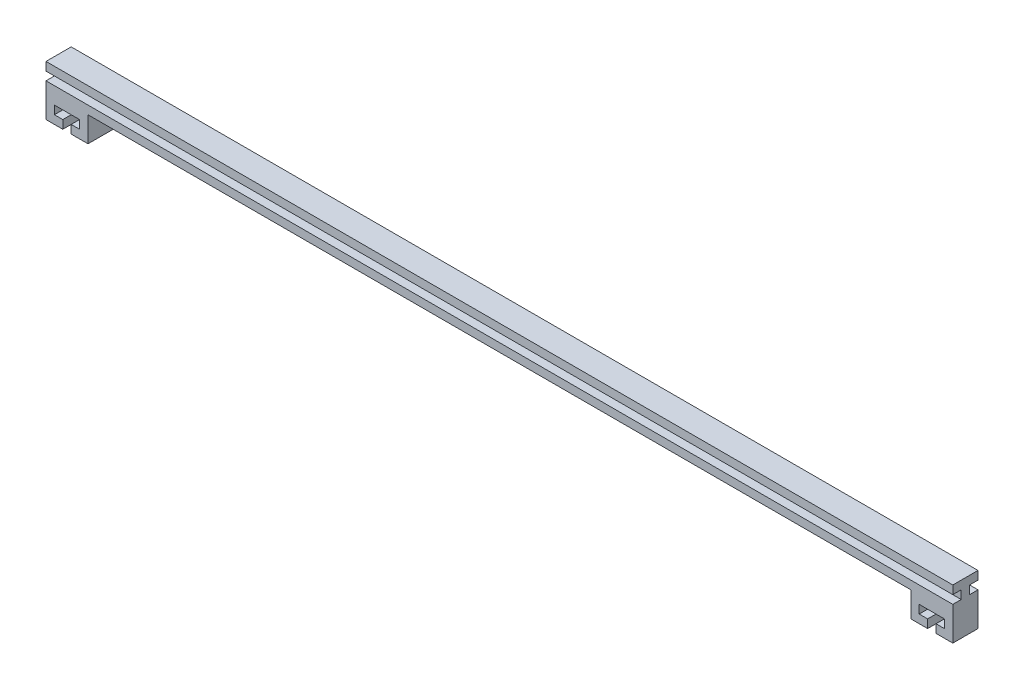
ISO-10303-21;
HEADER;
FILE_DESCRIPTION(('STEP AP214'),'2;1');
FILE_NAME('part.step','',(''),(''),'','','');
FILE_SCHEMA(('AUTOMOTIVE_DESIGN { 1 0 10303 214 1 1 1 1 }'));
ENDSEC;
DATA;
#1=APPLICATION_CONTEXT('core data for automotive mechanical design processes');
#2=APPLICATION_PROTOCOL_DEFINITION('international standard','automotive_design',2000,#1);
#3=PRODUCT_CONTEXT('',#1,'mechanical');
#4=PRODUCT('Part','Part','',(#3));
#5=PRODUCT_RELATED_PRODUCT_CATEGORY('part','',(#4));
#6=PRODUCT_DEFINITION_FORMATION('','',#4);
#7=PRODUCT_DEFINITION_CONTEXT('part definition',#1,'design');
#8=PRODUCT_DEFINITION('design','',#6,#7);
#9=PRODUCT_DEFINITION_SHAPE('','',#8);
#10=(LENGTH_UNIT() NAMED_UNIT(*) SI_UNIT(.MILLI.,.METRE.));
#11=(NAMED_UNIT(*) PLANE_ANGLE_UNIT() SI_UNIT($,.RADIAN.));
#12=(NAMED_UNIT(*) SI_UNIT($,.STERADIAN.) SOLID_ANGLE_UNIT());
#13=UNCERTAINTY_MEASURE_WITH_UNIT(LENGTH_MEASURE(1.E-05),#10,'distance_accuracy_value','');
#14=(GEOMETRIC_REPRESENTATION_CONTEXT(3) GLOBAL_UNCERTAINTY_ASSIGNED_CONTEXT((#13)) GLOBAL_UNIT_ASSIGNED_CONTEXT((#10,
#11,#12)) REPRESENTATION_CONTEXT('',''));
#15=CARTESIAN_POINT('',(0.,0.,0.));
#16=DIRECTION('',(0.,0.,1.));
#17=DIRECTION('',(1.,0.,0.));
#18=AXIS2_PLACEMENT_3D('',#15,#16,#17);
#19=CARTESIAN_POINT('',(2700.,200.,0.));
#20=DIRECTION('',(0.,-1.,0.));
#21=DIRECTION('',(0.,0.,-1.));
#22=AXIS2_PLACEMENT_3D('',#19,#20,#21);
#23=PLANE('',#22);
#24=DIRECTION('',(-1.,0.,0.));
#25=VECTOR('',#24,1.);
#26=CARTESIAN_POINT('',(2700.,200.,0.));
#27=LINE('',#26,#25);
#28=CARTESIAN_POINT('',(2450.,200.,0.));
#29=VERTEX_POINT('',#28);
#30=CARTESIAN_POINT('',(-2450.,200.,0.));
#31=VERTEX_POINT('',#30);
#32=EDGE_CURVE('E50',#29,#31,#27,.T.);
#33=ORIENTED_EDGE('',*,*,#32,.F.);
#34=DIRECTION('',(0.,0.,-1.));
#35=VECTOR('',#34,1.);
#36=CARTESIAN_POINT('',(2450.,200.,150.));
#37=LINE('',#36,#35);
#38=CARTESIAN_POINT('',(2450.,200.,150.));
#39=VERTEX_POINT('',#38);
#40=EDGE_CURVE('E54',#39,#29,#37,.T.);
#41=ORIENTED_EDGE('',*,*,#40,.F.);
#42=DIRECTION('',(-1.,0.,0.));
#43=VECTOR('',#42,1.);
#44=CARTESIAN_POINT('',(2700.,200.,150.));
#45=LINE('',#44,#43);
#46=CARTESIAN_POINT('',(-2450.,200.,150.));
#47=VERTEX_POINT('',#46);
#48=EDGE_CURVE('E259',#39,#47,#45,.T.);
#49=ORIENTED_EDGE('',*,*,#48,.T.);
#50=DIRECTION('',(0.,0.,-1.));
#51=VECTOR('',#50,1.);
#52=CARTESIAN_POINT('',(-2450.,200.,150.));
#53=LINE('',#52,#51);
#54=EDGE_CURVE('E378',#47,#31,#53,.T.);
#55=ORIENTED_EDGE('',*,*,#54,.T.);
#56=EDGE_LOOP('',(#33,#41,#49,#55));
#57=FACE_BOUND('',#56,.T.);
#58=ADVANCED_FACE('F35',(#57),#23,.T.);
#59=CARTESIAN_POINT('',(-2700.,49.9999999999997,150.));
#60=DIRECTION('',(1.,0.,0.));
#61=DIRECTION('',(0.,0.,-1.));
#62=AXIS2_PLACEMENT_3D('',#59,#60,#61);
#63=PLANE('',#62);
#64=DIRECTION('',(0.,-1.,0.));
#65=VECTOR('',#64,1.);
#66=CARTESIAN_POINT('',(-2700.,49.9999999999997,0.));
#67=LINE('',#66,#65);
#68=CARTESIAN_POINT('',(-2700.,250.,0.));
#69=VERTEX_POINT('',#68);
#70=CARTESIAN_POINT('',(-2700.,49.9999999999997,0.));
#71=VERTEX_POINT('',#70);
#72=EDGE_CURVE('E333',#69,#71,#67,.T.);
#73=ORIENTED_EDGE('',*,*,#72,.T.);
#74=DIRECTION('',(0.,0.,-1.));
#75=VECTOR('',#74,1.);
#76=CARTESIAN_POINT('',(-2700.,49.9999999999997,150.));
#77=LINE('',#76,#75);
#78=CARTESIAN_POINT('',(-2700.,49.9999999999997,150.));
#79=VERTEX_POINT('',#78);
#80=EDGE_CURVE('E11',#79,#71,#77,.T.);
#81=ORIENTED_EDGE('',*,*,#80,.F.);
#82=DIRECTION('',(0.,-1.,0.));
#83=VECTOR('',#82,1.);
#84=CARTESIAN_POINT('',(-2700.,49.9999999999997,150.));
#85=LINE('',#84,#83);
#86=CARTESIAN_POINT('',(-2700.,250.,150.));
#87=VERTEX_POINT('',#86);
#88=EDGE_CURVE('E355',#87,#79,#85,.T.);
#89=ORIENTED_EDGE('',*,*,#88,.F.);
#90=DIRECTION('',(0.,0.,-1.));
#91=VECTOR('',#90,1.);
#92=CARTESIAN_POINT('',(-2700.,250.,150.));
#93=LINE('',#92,#91);
#94=CARTESIAN_POINT('',(-2700.,250.,100.));
#95=VERTEX_POINT('',#94);
#96=EDGE_CURVE('E266',#87,#95,#93,.T.);
#97=ORIENTED_EDGE('',*,*,#96,.T.);
#98=DIRECTION('',(0.,1.,0.));
#99=VECTOR('',#98,1.);
#100=CARTESIAN_POINT('',(-2700.,250.,100.));
#101=LINE('',#100,#99);
#102=CARTESIAN_POINT('',(-2700.,300.,100.));
#103=VERTEX_POINT('',#102);
#104=EDGE_CURVE('E269',#95,#103,#101,.T.);
#105=ORIENTED_EDGE('',*,*,#104,.T.);
#106=DIRECTION('',(0.,0.,1.));
#107=VECTOR('',#106,1.);
#108=CARTESIAN_POINT('',(-2700.,300.,100.));
#109=LINE('',#108,#107);
#110=CARTESIAN_POINT('',(-2700.,300.,150.));
#111=VERTEX_POINT('',#110);
#112=EDGE_CURVE('E310',#103,#111,#109,.T.);
#113=ORIENTED_EDGE('',*,*,#112,.T.);
#114=DIRECTION('',(0.,1.,0.));
#115=VECTOR('',#114,1.);
#116=CARTESIAN_POINT('',(-2700.,300.,150.));
#117=LINE('',#116,#115);
#118=CARTESIAN_POINT('',(-2700.,350.,150.));
#119=VERTEX_POINT('',#118);
#120=EDGE_CURVE('E313',#111,#119,#117,.T.);
#121=ORIENTED_EDGE('',*,*,#120,.T.);
#122=DIRECTION('',(0.,0.,-1.));
#123=VECTOR('',#122,1.);
#124=CARTESIAN_POINT('',(-2700.,350.,150.));
#125=LINE('',#124,#123);
#126=CARTESIAN_POINT('',(-2700.,350.,0.));
#127=VERTEX_POINT('',#126);
#128=EDGE_CURVE('E316',#119,#127,#125,.T.);
#129=ORIENTED_EDGE('',*,*,#128,.T.);
#130=DIRECTION('',(0.,-1.,0.));
#131=VECTOR('',#130,1.);
#132=CARTESIAN_POINT('',(-2700.,350.,0.));
#133=LINE('',#132,#131);
#134=CARTESIAN_POINT('',(-2700.,300.,0.));
#135=VERTEX_POINT('',#134);
#136=EDGE_CURVE('E319',#127,#135,#133,.T.);
#137=ORIENTED_EDGE('',*,*,#136,.T.);
#138=DIRECTION('',(0.,0.,1.));
#139=VECTOR('',#138,1.);
#140=CARTESIAN_POINT('',(-2700.,300.,0.));
#141=LINE('',#140,#139);
#142=CARTESIAN_POINT('',(-2700.,300.,50.));
#143=VERTEX_POINT('',#142);
#144=EDGE_CURVE('E322',#135,#143,#141,.T.);
#145=ORIENTED_EDGE('',*,*,#144,.T.);
#146=DIRECTION('',(0.,-1.,0.));
#147=VECTOR('',#146,1.);
#148=CARTESIAN_POINT('',(-2700.,300.,50.));
#149=LINE('',#148,#147);
#150=CARTESIAN_POINT('',(-2700.,250.,50.));
#151=VERTEX_POINT('',#150);
#152=EDGE_CURVE('E325',#143,#151,#149,.T.);
#153=ORIENTED_EDGE('',*,*,#152,.T.);
#154=DIRECTION('',(0.,0.,-1.));
#155=VECTOR('',#154,1.);
#156=CARTESIAN_POINT('',(-2700.,250.,50.));
#157=LINE('',#156,#155);
#158=EDGE_CURVE('E278',#151,#69,#157,.T.);
#159=ORIENTED_EDGE('',*,*,#158,.T.);
#160=EDGE_LOOP('',(#73,#81,#89,#97,#105,#113,#121,#129,#137,#145,#153,#159));
#161=FACE_BOUND('',#160,.T.);
#162=ADVANCED_FACE('F37',(#161),#63,.F.);
#163=CARTESIAN_POINT('',(-2600.,49.9999999999997,150.));
#164=DIRECTION('',(0.,1.,0.));
#165=DIRECTION('',(0.,0.,1.));
#166=AXIS2_PLACEMENT_3D('',#163,#164,#165);
#167=PLANE('',#166);
#168=DIRECTION('',(1.,0.,0.));
#169=VECTOR('',#168,1.);
#170=CARTESIAN_POINT('',(-2600.,49.9999999999997,0.));
#171=LINE('',#170,#169);
#172=CARTESIAN_POINT('',(-2600.,49.9999999999997,0.));
#173=VERTEX_POINT('',#172);
#174=EDGE_CURVE('E381',#71,#173,#171,.T.);
#175=ORIENTED_EDGE('',*,*,#174,.T.);
#176=DIRECTION('',(0.,0.,-1.));
#177=VECTOR('',#176,1.);
#178=CARTESIAN_POINT('',(-2600.,49.9999999999997,150.));
#179=LINE('',#178,#177);
#180=CARTESIAN_POINT('',(-2600.,49.9999999999997,150.));
#181=VERTEX_POINT('',#180);
#182=EDGE_CURVE('E43',#181,#173,#179,.T.);
#183=ORIENTED_EDGE('',*,*,#182,.F.);
#184=DIRECTION('',(1.,0.,0.));
#185=VECTOR('',#184,1.);
#186=CARTESIAN_POINT('',(-2600.,49.9999999999997,150.));
#187=LINE('',#186,#185);
#188=EDGE_CURVE('E357',#79,#181,#187,.T.);
#189=ORIENTED_EDGE('',*,*,#188,.F.);
#190=ORIENTED_EDGE('',*,*,#80,.T.);
#191=EDGE_LOOP('',(#175,#183,#189,#190));
#192=FACE_BOUND('',#191,.T.);
#193=ADVANCED_FACE('F449',(#192),#167,.F.);
#194=CARTESIAN_POINT('',(-2600.,99.9999999999997,150.));
#195=DIRECTION('',(-1.,0.,0.));
#196=DIRECTION('',(0.,0.,1.));
#197=AXIS2_PLACEMENT_3D('',#194,#195,#196);
#198=PLANE('',#197);
#199=DIRECTION('',(0.,1.,0.));
#200=VECTOR('',#199,1.);
#201=CARTESIAN_POINT('',(-2600.,99.9999999999997,0.));
#202=LINE('',#201,#200);
#203=CARTESIAN_POINT('',(-2600.,99.9999999999997,0.));
#204=VERTEX_POINT('',#203);
#205=EDGE_CURVE('E383',#173,#204,#202,.T.);
#206=ORIENTED_EDGE('',*,*,#205,.T.);
#207=DIRECTION('',(0.,0.,-1.));
#208=VECTOR('',#207,1.);
#209=CARTESIAN_POINT('',(-2600.,99.9999999999997,150.));
#210=LINE('',#209,#208);
#211=CARTESIAN_POINT('',(-2600.,99.9999999999997,150.));
#212=VERTEX_POINT('',#211);
#213=EDGE_CURVE('E423',#212,#204,#210,.T.);
#214=ORIENTED_EDGE('',*,*,#213,.F.);
#215=DIRECTION('',(0.,1.,0.));
#216=VECTOR('',#215,1.);
#217=CARTESIAN_POINT('',(-2600.,99.9999999999997,150.));
#218=LINE('',#217,#216);
#219=EDGE_CURVE('E360',#181,#212,#218,.T.);
#220=ORIENTED_EDGE('',*,*,#219,.F.);
#221=ORIENTED_EDGE('',*,*,#182,.T.);
#222=EDGE_LOOP('',(#206,#214,#220,#221));
#223=FACE_BOUND('',#222,.T.);
#224=ADVANCED_FACE('F430',(#223),#198,.F.);
#225=CARTESIAN_POINT('',(-2650.,99.9999999999997,150.));
#226=DIRECTION('',(0.,-1.,0.));
#227=DIRECTION('',(0.,0.,-1.));
#228=AXIS2_PLACEMENT_3D('',#225,#226,#227);
#229=PLANE('',#228);
#230=DIRECTION('',(-1.,0.,0.));
#231=VECTOR('',#230,1.);
#232=CARTESIAN_POINT('',(-2650.,99.9999999999997,0.));
#233=LINE('',#232,#231);
#234=CARTESIAN_POINT('',(-2650.,99.9999999999997,0.));
#235=VERTEX_POINT('',#234);
#236=EDGE_CURVE('E385',#204,#235,#233,.T.);
#237=ORIENTED_EDGE('',*,*,#236,.T.);
#238=DIRECTION('',(0.,0.,-1.));
#239=VECTOR('',#238,1.);
#240=CARTESIAN_POINT('',(-2650.,99.9999999999997,150.));
#241=LINE('',#240,#239);
#242=CARTESIAN_POINT('',(-2650.,99.9999999999997,150.));
#243=VERTEX_POINT('',#242);
#244=EDGE_CURVE('E420',#243,#235,#241,.T.);
#245=ORIENTED_EDGE('',*,*,#244,.F.);
#246=DIRECTION('',(-1.,0.,0.));
#247=VECTOR('',#246,1.);
#248=CARTESIAN_POINT('',(-2650.,99.9999999999997,150.));
#249=LINE('',#248,#247);
#250=EDGE_CURVE('E362',#212,#243,#249,.T.);
#251=ORIENTED_EDGE('',*,*,#250,.F.);
#252=ORIENTED_EDGE('',*,*,#213,.T.);
#253=EDGE_LOOP('',(#237,#245,#251,#252));
#254=FACE_BOUND('',#253,.T.);
#255=ADVANCED_FACE('F440',(#254),#229,.F.);
#256=CARTESIAN_POINT('',(-2650.,150.,150.));
#257=DIRECTION('',(-1.,0.,0.));
#258=DIRECTION('',(0.,0.,1.));
#259=AXIS2_PLACEMENT_3D('',#256,#257,#258);
#260=PLANE('',#259);
#261=DIRECTION('',(0.,1.,0.));
#262=VECTOR('',#261,1.);
#263=CARTESIAN_POINT('',(-2650.,150.,0.));
#264=LINE('',#263,#262);
#265=CARTESIAN_POINT('',(-2650.,150.,0.));
#266=VERTEX_POINT('',#265);
#267=EDGE_CURVE('E387',#235,#266,#264,.T.);
#268=ORIENTED_EDGE('',*,*,#267,.T.);
#269=DIRECTION('',(0.,0.,-1.));
#270=VECTOR('',#269,1.);
#271=CARTESIAN_POINT('',(-2650.,150.,150.));
#272=LINE('',#271,#270);
#273=CARTESIAN_POINT('',(-2650.,150.,150.));
#274=VERTEX_POINT('',#273);
#275=EDGE_CURVE('E417',#274,#266,#272,.T.);
#276=ORIENTED_EDGE('',*,*,#275,.F.);
#277=DIRECTION('',(0.,1.,0.));
#278=VECTOR('',#277,1.);
#279=CARTESIAN_POINT('',(-2650.,150.,150.));
#280=LINE('',#279,#278);
#281=EDGE_CURVE('E364',#243,#274,#280,.T.);
#282=ORIENTED_EDGE('',*,*,#281,.F.);
#283=ORIENTED_EDGE('',*,*,#244,.T.);
#284=EDGE_LOOP('',(#268,#276,#282,#283));
#285=FACE_BOUND('',#284,.T.);
#286=ADVANCED_FACE('F444',(#285),#260,.F.);
#287=CARTESIAN_POINT('',(-2500.,150.,150.));
#288=DIRECTION('',(0.,1.,0.));
#289=DIRECTION('',(-1.,0.,0.));
#290=AXIS2_PLACEMENT_3D('',#287,#288,#289);
#291=PLANE('',#290);
#292=DIRECTION('',(1.,0.,0.));
#293=VECTOR('',#292,1.);
#294=CARTESIAN_POINT('',(-2500.,150.,0.));
#295=LINE('',#294,#293);
#296=CARTESIAN_POINT('',(-2500.,150.,0.));
#297=VERTEX_POINT('',#296);
#298=EDGE_CURVE('E389',#266,#297,#295,.T.);
#299=ORIENTED_EDGE('',*,*,#298,.T.);
#300=DIRECTION('',(0.,0.,-1.));
#301=VECTOR('',#300,1.);
#302=CARTESIAN_POINT('',(-2500.,150.,150.));
#303=LINE('',#302,#301);
#304=CARTESIAN_POINT('',(-2500.,150.,150.));
#305=VERTEX_POINT('',#304);
#306=EDGE_CURVE('E414',#305,#297,#303,.T.);
#307=ORIENTED_EDGE('',*,*,#306,.F.);
#308=DIRECTION('',(1.,0.,0.));
#309=VECTOR('',#308,1.);
#310=CARTESIAN_POINT('',(-2500.,150.,150.));
#311=LINE('',#310,#309);
#312=EDGE_CURVE('E366',#274,#305,#311,.T.);
#313=ORIENTED_EDGE('',*,*,#312,.F.);
#314=ORIENTED_EDGE('',*,*,#275,.T.);
#315=EDGE_LOOP('',(#299,#307,#313,#314));
#316=FACE_BOUND('',#315,.T.);
#317=ADVANCED_FACE('F597',(#316),#291,.F.);
#318=CARTESIAN_POINT('',(-2500.,99.9999999999997,150.));
#319=DIRECTION('',(1.,0.,0.));
#320=DIRECTION('',(0.,0.,-1.));
#321=AXIS2_PLACEMENT_3D('',#318,#319,#320);
#322=PLANE('',#321);
#323=DIRECTION('',(0.,-1.,0.));
#324=VECTOR('',#323,1.);
#325=CARTESIAN_POINT('',(-2500.,99.9999999999997,0.));
#326=LINE('',#325,#324);
#327=CARTESIAN_POINT('',(-2500.,99.9999999999997,0.));
#328=VERTEX_POINT('',#327);
#329=EDGE_CURVE('E391',#297,#328,#326,.T.);
#330=ORIENTED_EDGE('',*,*,#329,.T.);
#331=DIRECTION('',(0.,0.,-1.));
#332=VECTOR('',#331,1.);
#333=CARTESIAN_POINT('',(-2500.,99.9999999999997,150.));
#334=LINE('',#333,#332);
#335=CARTESIAN_POINT('',(-2500.,99.9999999999997,150.));
#336=VERTEX_POINT('',#335);
#337=EDGE_CURVE('E411',#336,#328,#334,.T.);
#338=ORIENTED_EDGE('',*,*,#337,.F.);
#339=DIRECTION('',(0.,-1.,0.));
#340=VECTOR('',#339,1.);
#341=CARTESIAN_POINT('',(-2500.,99.9999999999997,150.));
#342=LINE('',#341,#340);
#343=EDGE_CURVE('E368',#305,#336,#342,.T.);
#344=ORIENTED_EDGE('',*,*,#343,.F.);
#345=ORIENTED_EDGE('',*,*,#306,.T.);
#346=EDGE_LOOP('',(#330,#338,#344,#345));
#347=FACE_BOUND('',#346,.T.);
#348=ADVANCED_FACE('F593',(#347),#322,.F.);
#349=CARTESIAN_POINT('',(-2550.,99.9999999999997,150.));
#350=DIRECTION('',(0.,-1.,0.));
#351=DIRECTION('',(0.,0.,-1.));
#352=AXIS2_PLACEMENT_3D('',#349,#350,#351);
#353=PLANE('',#352);
#354=DIRECTION('',(-1.,0.,0.));
#355=VECTOR('',#354,1.);
#356=CARTESIAN_POINT('',(-2550.,99.9999999999997,0.));
#357=LINE('',#356,#355);
#358=CARTESIAN_POINT('',(-2550.,99.9999999999997,0.));
#359=VERTEX_POINT('',#358);
#360=EDGE_CURVE('E393',#328,#359,#357,.T.);
#361=ORIENTED_EDGE('',*,*,#360,.T.);
#362=DIRECTION('',(0.,0.,-1.));
#363=VECTOR('',#362,1.);
#364=CARTESIAN_POINT('',(-2550.,99.9999999999997,150.));
#365=LINE('',#364,#363);
#366=CARTESIAN_POINT('',(-2550.,99.9999999999997,150.));
#367=VERTEX_POINT('',#366);
#368=EDGE_CURVE('E408',#367,#359,#365,.T.);
#369=ORIENTED_EDGE('',*,*,#368,.F.);
#370=DIRECTION('',(-1.,0.,0.));
#371=VECTOR('',#370,1.);
#372=CARTESIAN_POINT('',(-2550.,99.9999999999997,150.));
#373=LINE('',#372,#371);
#374=EDGE_CURVE('E370',#336,#367,#373,.T.);
#375=ORIENTED_EDGE('',*,*,#374,.F.);
#376=ORIENTED_EDGE('',*,*,#337,.T.);
#377=EDGE_LOOP('',(#361,#369,#375,#376));
#378=FACE_BOUND('',#377,.T.);
#379=ADVANCED_FACE('F589',(#378),#353,.F.);
#380=CARTESIAN_POINT('',(-2550.,49.9999999999997,150.));
#381=DIRECTION('',(1.,0.,0.));
#382=DIRECTION('',(0.,0.,-1.));
#383=AXIS2_PLACEMENT_3D('',#380,#381,#382);
#384=PLANE('',#383);
#385=DIRECTION('',(0.,-1.,0.));
#386=VECTOR('',#385,1.);
#387=CARTESIAN_POINT('',(-2550.,49.9999999999997,0.));
#388=LINE('',#387,#386);
#389=CARTESIAN_POINT('',(-2550.,49.9999999999997,0.));
#390=VERTEX_POINT('',#389);
#391=EDGE_CURVE('E395',#359,#390,#388,.T.);
#392=ORIENTED_EDGE('',*,*,#391,.T.);
#393=DIRECTION('',(0.,0.,-1.));
#394=VECTOR('',#393,1.);
#395=CARTESIAN_POINT('',(-2550.,49.9999999999997,150.));
#396=LINE('',#395,#394);
#397=CARTESIAN_POINT('',(-2550.,49.9999999999997,150.));
#398=VERTEX_POINT('',#397);
#399=EDGE_CURVE('E405',#398,#390,#396,.T.);
#400=ORIENTED_EDGE('',*,*,#399,.F.);
#401=DIRECTION('',(0.,-1.,0.));
#402=VECTOR('',#401,1.);
#403=CARTESIAN_POINT('',(-2550.,49.9999999999997,150.));
#404=LINE('',#403,#402);
#405=EDGE_CURVE('E372',#367,#398,#404,.T.);
#406=ORIENTED_EDGE('',*,*,#405,.F.);
#407=ORIENTED_EDGE('',*,*,#368,.T.);
#408=EDGE_LOOP('',(#392,#400,#406,#407));
#409=FACE_BOUND('',#408,.T.);
#410=ADVANCED_FACE('F585',(#409),#384,.F.);
#411=CARTESIAN_POINT('',(-2450.,49.9999999999997,150.));
#412=DIRECTION('',(0.,1.,0.));
#413=DIRECTION('',(-1.,0.,0.));
#414=AXIS2_PLACEMENT_3D('',#411,#412,#413);
#415=PLANE('',#414);
#416=DIRECTION('',(1.,0.,0.));
#417=VECTOR('',#416,1.);
#418=CARTESIAN_POINT('',(-2450.,49.9999999999997,0.));
#419=LINE('',#418,#417);
#420=CARTESIAN_POINT('',(-2450.,49.9999999999997,0.));
#421=VERTEX_POINT('',#420);
#422=EDGE_CURVE('E397',#390,#421,#419,.T.);
#423=ORIENTED_EDGE('',*,*,#422,.T.);
#424=DIRECTION('',(0.,0.,-1.));
#425=VECTOR('',#424,1.);
#426=CARTESIAN_POINT('',(-2450.,49.9999999999997,150.));
#427=LINE('',#426,#425);
#428=CARTESIAN_POINT('',(-2450.,49.9999999999997,150.));
#429=VERTEX_POINT('',#428);
#430=EDGE_CURVE('E402',#429,#421,#427,.T.);
#431=ORIENTED_EDGE('',*,*,#430,.F.);
#432=DIRECTION('',(1.,0.,0.));
#433=VECTOR('',#432,1.);
#434=CARTESIAN_POINT('',(-2450.,49.9999999999997,150.));
#435=LINE('',#434,#433);
#436=EDGE_CURVE('E374',#398,#429,#435,.T.);
#437=ORIENTED_EDGE('',*,*,#436,.F.);
#438=ORIENTED_EDGE('',*,*,#399,.T.);
#439=EDGE_LOOP('',(#423,#431,#437,#438));
#440=FACE_BOUND('',#439,.T.);
#441=ADVANCED_FACE('F581',(#440),#415,.F.);
#442=CARTESIAN_POINT('',(-2450.,49.9999999999997,150.));
#443=DIRECTION('',(-1.,0.,0.));
#444=DIRECTION('',(0.,0.,1.));
#445=AXIS2_PLACEMENT_3D('',#442,#443,#444);
#446=PLANE('',#445);
#447=DIRECTION('',(0.,1.,0.));
#448=VECTOR('',#447,1.);
#449=CARTESIAN_POINT('',(-2450.,49.9999999999997,0.));
#450=LINE('',#449,#448);
#451=EDGE_CURVE('E358',#421,#31,#450,.T.);
#452=ORIENTED_EDGE('',*,*,#451,.T.);
#453=ORIENTED_EDGE('',*,*,#54,.F.);
#454=DIRECTION('',(0.,1.,0.));
#455=VECTOR('',#454,1.);
#456=CARTESIAN_POINT('',(-2450.,49.9999999999997,150.));
#457=LINE('',#456,#455);
#458=EDGE_CURVE('E376',#429,#47,#457,.T.);
#459=ORIENTED_EDGE('',*,*,#458,.F.);
#460=ORIENTED_EDGE('',*,*,#430,.T.);
#461=EDGE_LOOP('',(#452,#453,#459,#460));
#462=FACE_BOUND('',#461,.T.);
#463=ADVANCED_FACE('F576',(#462),#446,.F.);
#464=CARTESIAN_POINT('',(0.,0.,150.));
#465=DIRECTION('',(0.,0.,1.));
#466=DIRECTION('',(1.,0.,0.));
#467=AXIS2_PLACEMENT_3D('',#464,#465,#466);
#468=PLANE('',#467);
#469=ORIENTED_EDGE('',*,*,#88,.T.);
#470=ORIENTED_EDGE('',*,*,#188,.T.);
#471=ORIENTED_EDGE('',*,*,#219,.T.);
#472=ORIENTED_EDGE('',*,*,#250,.T.);
#473=ORIENTED_EDGE('',*,*,#281,.T.);
#474=ORIENTED_EDGE('',*,*,#312,.T.);
#475=ORIENTED_EDGE('',*,*,#343,.T.);
#476=ORIENTED_EDGE('',*,*,#374,.T.);
#477=ORIENTED_EDGE('',*,*,#405,.T.);
#478=ORIENTED_EDGE('',*,*,#436,.T.);
#479=ORIENTED_EDGE('',*,*,#458,.T.);
#480=ORIENTED_EDGE('',*,*,#48,.F.);
#481=DIRECTION('',(0.,-1.,0.));
#482=VECTOR('',#481,1.);
#483=CARTESIAN_POINT('',(2450.,49.9999999999997,150.));
#484=LINE('',#483,#482);
#485=CARTESIAN_POINT('',(2450.,49.9999999999997,150.));
#486=VERTEX_POINT('',#485);
#487=EDGE_CURVE('E253',#39,#486,#484,.T.);
#488=ORIENTED_EDGE('',*,*,#487,.T.);
#489=DIRECTION('',(1.,0.,0.));
#490=VECTOR('',#489,1.);
#491=CARTESIAN_POINT('',(2450.,49.9999999999997,150.));
#492=LINE('',#491,#490);
#493=CARTESIAN_POINT('',(2550.,49.9999999999997,150.));
#494=VERTEX_POINT('',#493);
#495=EDGE_CURVE('E242',#486,#494,#492,.T.);
#496=ORIENTED_EDGE('',*,*,#495,.T.);
#497=DIRECTION('',(0.,1.,0.));
#498=VECTOR('',#497,1.);
#499=CARTESIAN_POINT('',(2550.,49.9999999999997,150.));
#500=LINE('',#499,#498);
#501=CARTESIAN_POINT('',(2550.,99.9999999999997,150.));
#502=VERTEX_POINT('',#501);
#503=EDGE_CURVE('E252',#494,#502,#500,.T.);
#504=ORIENTED_EDGE('',*,*,#503,.T.);
#505=DIRECTION('',(-1.,0.,0.));
#506=VECTOR('',#505,1.);
#507=CARTESIAN_POINT('',(2550.,99.9999999999997,150.));
#508=LINE('',#507,#506);
#509=CARTESIAN_POINT('',(2500.,99.9999999999997,150.));
#510=VERTEX_POINT('',#509);
#511=EDGE_CURVE('E504',#502,#510,#508,.T.);
#512=ORIENTED_EDGE('',*,*,#511,.T.);
#513=DIRECTION('',(0.,1.,0.));
#514=VECTOR('',#513,1.);
#515=CARTESIAN_POINT('',(2500.,99.9999999999997,150.));
#516=LINE('',#515,#514);
#517=CARTESIAN_POINT('',(2500.,150.,150.));
#518=VERTEX_POINT('',#517);
#519=EDGE_CURVE('E541',#510,#518,#516,.T.);
#520=ORIENTED_EDGE('',*,*,#519,.T.);
#521=DIRECTION('',(1.,0.,0.));
#522=VECTOR('',#521,1.);
#523=CARTESIAN_POINT('',(2500.,150.,150.));
#524=LINE('',#523,#522);
#525=CARTESIAN_POINT('',(2650.,150.,150.));
#526=VERTEX_POINT('',#525);
#527=EDGE_CURVE('E545',#518,#526,#524,.T.);
#528=ORIENTED_EDGE('',*,*,#527,.T.);
#529=DIRECTION('',(0.,-1.,0.));
#530=VECTOR('',#529,1.);
#531=CARTESIAN_POINT('',(2650.,150.,150.));
#532=LINE('',#531,#530);
#533=CARTESIAN_POINT('',(2650.,99.9999999999997,150.));
#534=VERTEX_POINT('',#533);
#535=EDGE_CURVE('E535',#526,#534,#532,.T.);
#536=ORIENTED_EDGE('',*,*,#535,.T.);
#537=DIRECTION('',(-1.,0.,0.));
#538=VECTOR('',#537,1.);
#539=CARTESIAN_POINT('',(2650.,99.9999999999997,150.));
#540=LINE('',#539,#538);
#541=CARTESIAN_POINT('',(2600.,99.9999999999997,150.));
#542=VERTEX_POINT('',#541);
#543=EDGE_CURVE('E532',#534,#542,#540,.T.);
#544=ORIENTED_EDGE('',*,*,#543,.T.);
#545=DIRECTION('',(0.,-1.,0.));
#546=VECTOR('',#545,1.);
#547=CARTESIAN_POINT('',(2600.,99.9999999999997,150.));
#548=LINE('',#547,#546);
#549=CARTESIAN_POINT('',(2600.,50.0000000000029,150.));
#550=VERTEX_POINT('',#549);
#551=EDGE_CURVE('E530',#542,#550,#548,.T.);
#552=ORIENTED_EDGE('',*,*,#551,.T.);
#553=DIRECTION('',(1.,0.,0.));
#554=VECTOR('',#553,1.);
#555=CARTESIAN_POINT('',(2600.,50.0000000000029,150.));
#556=LINE('',#555,#554);
#557=CARTESIAN_POINT('',(2700.,49.9999999999997,150.));
#558=VERTEX_POINT('',#557);
#559=EDGE_CURVE('E479',#550,#558,#556,.T.);
#560=ORIENTED_EDGE('',*,*,#559,.T.);
#561=DIRECTION('',(0.,1.,0.));
#562=VECTOR('',#561,1.);
#563=CARTESIAN_POINT('',(2700.,200.,150.));
#564=LINE('',#563,#562);
#565=CARTESIAN_POINT('',(2700.,250.,150.));
#566=VERTEX_POINT('',#565);
#567=EDGE_CURVE('E277',#558,#566,#564,.T.);
#568=ORIENTED_EDGE('',*,*,#567,.T.);
#569=DIRECTION('',(-1.,0.,0.));
#570=VECTOR('',#569,1.);
#571=CARTESIAN_POINT('',(2700.,250.,150.));
#572=LINE('',#571,#570);
#573=EDGE_CURVE('E350',#566,#87,#572,.T.);
#574=ORIENTED_EDGE('',*,*,#573,.T.);
#575=EDGE_LOOP('',(#469,#470,#471,#472,#473,#474,#475,#476,#477,#478,#479,#480,#488,#496,#504,
#512,#520,#528,#536,#544,#552,#560,#568,#574));
#576=FACE_BOUND('',#575,.T.);
#577=ADVANCED_FACE('F257',(#576),#468,.T.);
#578=CARTESIAN_POINT('',(0.,0.,0.));
#579=DIRECTION('',(0.,0.,1.));
#580=DIRECTION('',(1.,0.,0.));
#581=AXIS2_PLACEMENT_3D('',#578,#579,#580);
#582=PLANE('',#581);
#583=ORIENTED_EDGE('',*,*,#72,.F.);
#584=DIRECTION('',(-1.,0.,0.));
#585=VECTOR('',#584,1.);
#586=CARTESIAN_POINT('',(2700.,250.,0.));
#587=LINE('',#586,#585);
#588=CARTESIAN_POINT('',(2700.,250.,0.));
#589=VERTEX_POINT('',#588);
#590=EDGE_CURVE('E330',#589,#69,#587,.T.);
#591=ORIENTED_EDGE('',*,*,#590,.F.);
#592=DIRECTION('',(0.,-1.,0.));
#593=VECTOR('',#592,1.);
#594=CARTESIAN_POINT('',(2700.,250.,0.));
#595=LINE('',#594,#593);
#596=CARTESIAN_POINT('',(2700.,49.9999999999997,0.));
#597=VERTEX_POINT('',#596);
#598=EDGE_CURVE('E275',#589,#597,#595,.T.);
#599=ORIENTED_EDGE('',*,*,#598,.T.);
#600=DIRECTION('',(1.,0.,0.));
#601=VECTOR('',#600,1.);
#602=CARTESIAN_POINT('',(2600.,50.0000000000029,0.));
#603=LINE('',#602,#601);
#604=CARTESIAN_POINT('',(2600.,50.0000000000029,0.));
#605=VERTEX_POINT('',#604);
#606=EDGE_CURVE('E261',#605,#597,#603,.T.);
#607=ORIENTED_EDGE('',*,*,#606,.F.);
#608=DIRECTION('',(0.,-1.,0.));
#609=VECTOR('',#608,1.);
#610=CARTESIAN_POINT('',(2600.,99.9999999999997,0.));
#611=LINE('',#610,#609);
#612=CARTESIAN_POINT('',(2600.,99.9999999999997,0.));
#613=VERTEX_POINT('',#612);
#614=EDGE_CURVE('E472',#613,#605,#611,.T.);
#615=ORIENTED_EDGE('',*,*,#614,.F.);
#616=DIRECTION('',(-1.,0.,0.));
#617=VECTOR('',#616,1.);
#618=CARTESIAN_POINT('',(2650.,99.9999999999997,0.));
#619=LINE('',#618,#617);
#620=CARTESIAN_POINT('',(2650.,99.9999999999997,0.));
#621=VERTEX_POINT('',#620);
#622=EDGE_CURVE('E474',#621,#613,#619,.T.);
#623=ORIENTED_EDGE('',*,*,#622,.F.);
#624=DIRECTION('',(0.,-1.,0.));
#625=VECTOR('',#624,1.);
#626=CARTESIAN_POINT('',(2650.,150.,0.));
#627=LINE('',#626,#625);
#628=CARTESIAN_POINT('',(2650.,150.,0.));
#629=VERTEX_POINT('',#628);
#630=EDGE_CURVE('E519',#629,#621,#627,.T.);
#631=ORIENTED_EDGE('',*,*,#630,.F.);
#632=DIRECTION('',(1.,0.,0.));
#633=VECTOR('',#632,1.);
#634=CARTESIAN_POINT('',(2500.,150.,0.));
#635=LINE('',#634,#633);
#636=CARTESIAN_POINT('',(2500.,150.,0.));
#637=VERTEX_POINT('',#636);
#638=EDGE_CURVE('E512',#637,#629,#635,.T.);
#639=ORIENTED_EDGE('',*,*,#638,.F.);
#640=DIRECTION('',(0.,1.,0.));
#641=VECTOR('',#640,1.);
#642=CARTESIAN_POINT('',(2500.,99.9999999999997,0.));
#643=LINE('',#642,#641);
#644=CARTESIAN_POINT('',(2500.,99.9999999999997,0.));
#645=VERTEX_POINT('',#644);
#646=EDGE_CURVE('E510',#645,#637,#643,.T.);
#647=ORIENTED_EDGE('',*,*,#646,.F.);
#648=DIRECTION('',(-1.,0.,0.));
#649=VECTOR('',#648,1.);
#650=CARTESIAN_POINT('',(2550.,99.9999999999997,0.));
#651=LINE('',#650,#649);
#652=CARTESIAN_POINT('',(2550.,99.9999999999997,0.));
#653=VERTEX_POINT('',#652);
#654=EDGE_CURVE('E503',#653,#645,#651,.T.);
#655=ORIENTED_EDGE('',*,*,#654,.F.);
#656=DIRECTION('',(0.,1.,0.));
#657=VECTOR('',#656,1.);
#658=CARTESIAN_POINT('',(2550.,49.9999999999997,0.));
#659=LINE('',#658,#657);
#660=CARTESIAN_POINT('',(2550.,49.9999999999997,0.));
#661=VERTEX_POINT('',#660);
#662=EDGE_CURVE('E508',#661,#653,#659,.T.);
#663=ORIENTED_EDGE('',*,*,#662,.F.);
#664=DIRECTION('',(1.,0.,0.));
#665=VECTOR('',#664,1.);
#666=CARTESIAN_POINT('',(2450.,49.9999999999997,0.));
#667=LINE('',#666,#665);
#668=CARTESIAN_POINT('',(2450.,49.9999999999997,0.));
#669=VERTEX_POINT('',#668);
#670=EDGE_CURVE('E514',#669,#661,#667,.T.);
#671=ORIENTED_EDGE('',*,*,#670,.F.);
#672=DIRECTION('',(0.,-1.,0.));
#673=VECTOR('',#672,1.);
#674=CARTESIAN_POINT('',(2450.,49.9999999999997,0.));
#675=LINE('',#674,#673);
#676=EDGE_CURVE('E265',#29,#669,#675,.T.);
#677=ORIENTED_EDGE('',*,*,#676,.F.);
#678=ORIENTED_EDGE('',*,*,#32,.T.);
#679=ORIENTED_EDGE('',*,*,#451,.F.);
#680=ORIENTED_EDGE('',*,*,#422,.F.);
#681=ORIENTED_EDGE('',*,*,#391,.F.);
#682=ORIENTED_EDGE('',*,*,#360,.F.);
#683=ORIENTED_EDGE('',*,*,#329,.F.);
#684=ORIENTED_EDGE('',*,*,#298,.F.);
#685=ORIENTED_EDGE('',*,*,#267,.F.);
#686=ORIENTED_EDGE('',*,*,#236,.F.);
#687=ORIENTED_EDGE('',*,*,#205,.F.);
#688=ORIENTED_EDGE('',*,*,#174,.F.);
#689=EDGE_LOOP('',(#583,#591,#599,#607,#615,#623,#631,#639,#647,#655,#663,#671,#677,#678,#679,
#680,#681,#682,#683,#684,#685,#686,#687,#688));
#690=FACE_BOUND('',#689,.T.);
#691=ADVANCED_FACE('F435',(#690),#582,.F.);
#692=CARTESIAN_POINT('',(2700.,250.,50.));
#693=DIRECTION('',(0.,1.,0.));
#694=DIRECTION('',(0.,0.,1.));
#695=AXIS2_PLACEMENT_3D('',#692,#693,#694);
#696=PLANE('',#695);
#697=ORIENTED_EDGE('',*,*,#158,.F.);
#698=DIRECTION('',(-1.,0.,0.));
#699=VECTOR('',#698,1.);
#700=CARTESIAN_POINT('',(2700.,250.,50.));
#701=LINE('',#700,#699);
#702=CARTESIAN_POINT('',(2700.,250.,50.));
#703=VERTEX_POINT('',#702);
#704=EDGE_CURVE('E334',#703,#151,#701,.T.);
#705=ORIENTED_EDGE('',*,*,#704,.F.);
#706=DIRECTION('',(0.,0.,-1.));
#707=VECTOR('',#706,1.);
#708=CARTESIAN_POINT('',(2700.,250.,50.));
#709=LINE('',#708,#707);
#710=EDGE_CURVE('E305',#703,#589,#709,.T.);
#711=ORIENTED_EDGE('',*,*,#710,.T.);
#712=ORIENTED_EDGE('',*,*,#590,.T.);
#713=EDGE_LOOP('',(#697,#705,#711,#712));
#714=FACE_BOUND('',#713,.T.);
#715=ADVANCED_FACE('F454',(#714),#696,.T.);
#716=CARTESIAN_POINT('',(2700.,300.,50.));
#717=DIRECTION('',(0.,0.,-1.));
#718=DIRECTION('',(0.,1.,0.));
#719=AXIS2_PLACEMENT_3D('',#716,#717,#718);
#720=PLANE('',#719);
#721=ORIENTED_EDGE('',*,*,#152,.F.);
#722=DIRECTION('',(-1.,0.,0.));
#723=VECTOR('',#722,1.);
#724=CARTESIAN_POINT('',(2700.,300.,50.));
#725=LINE('',#724,#723);
#726=CARTESIAN_POINT('',(2700.,300.,50.));
#727=VERTEX_POINT('',#726);
#728=EDGE_CURVE('E336',#727,#143,#725,.T.);
#729=ORIENTED_EDGE('',*,*,#728,.F.);
#730=DIRECTION('',(0.,-1.,0.));
#731=VECTOR('',#730,1.);
#732=CARTESIAN_POINT('',(2700.,300.,50.));
#733=LINE('',#732,#731);
#734=EDGE_CURVE('E302',#727,#703,#733,.T.);
#735=ORIENTED_EDGE('',*,*,#734,.T.);
#736=ORIENTED_EDGE('',*,*,#704,.T.);
#737=EDGE_LOOP('',(#721,#729,#735,#736));
#738=FACE_BOUND('',#737,.T.);
#739=ADVANCED_FACE('F662',(#738),#720,.T.);
#740=CARTESIAN_POINT('',(2700.,300.,0.));
#741=DIRECTION('',(0.,-1.,0.));
#742=DIRECTION('',(0.,0.,-1.));
#743=AXIS2_PLACEMENT_3D('',#740,#741,#742);
#744=PLANE('',#743);
#745=ORIENTED_EDGE('',*,*,#144,.F.);
#746=DIRECTION('',(-1.,0.,0.));
#747=VECTOR('',#746,1.);
#748=CARTESIAN_POINT('',(2700.,300.,0.));
#749=LINE('',#748,#747);
#750=CARTESIAN_POINT('',(2700.,300.,0.));
#751=VERTEX_POINT('',#750);
#752=EDGE_CURVE('E338',#751,#135,#749,.T.);
#753=ORIENTED_EDGE('',*,*,#752,.F.);
#754=DIRECTION('',(0.,0.,1.));
#755=VECTOR('',#754,1.);
#756=CARTESIAN_POINT('',(2700.,300.,0.));
#757=LINE('',#756,#755);
#758=EDGE_CURVE('E299',#751,#727,#757,.T.);
#759=ORIENTED_EDGE('',*,*,#758,.T.);
#760=ORIENTED_EDGE('',*,*,#728,.T.);
#761=EDGE_LOOP('',(#745,#753,#759,#760));
#762=FACE_BOUND('',#761,.T.);
#763=ADVANCED_FACE('F669',(#762),#744,.T.);
#764=CARTESIAN_POINT('',(2700.,350.,0.));
#765=DIRECTION('',(0.,0.,-1.));
#766=DIRECTION('',(0.,1.,0.));
#767=AXIS2_PLACEMENT_3D('',#764,#765,#766);
#768=PLANE('',#767);
#769=ORIENTED_EDGE('',*,*,#136,.F.);
#770=DIRECTION('',(-1.,0.,0.));
#771=VECTOR('',#770,1.);
#772=CARTESIAN_POINT('',(2700.,350.,0.));
#773=LINE('',#772,#771);
#774=CARTESIAN_POINT('',(2700.,350.,0.));
#775=VERTEX_POINT('',#774);
#776=EDGE_CURVE('E340',#775,#127,#773,.T.);
#777=ORIENTED_EDGE('',*,*,#776,.F.);
#778=DIRECTION('',(0.,-1.,0.));
#779=VECTOR('',#778,1.);
#780=CARTESIAN_POINT('',(2700.,350.,0.));
#781=LINE('',#780,#779);
#782=EDGE_CURVE('E296',#775,#751,#781,.T.);
#783=ORIENTED_EDGE('',*,*,#782,.T.);
#784=ORIENTED_EDGE('',*,*,#752,.T.);
#785=EDGE_LOOP('',(#769,#777,#783,#784));
#786=FACE_BOUND('',#785,.T.);
#787=ADVANCED_FACE('F677',(#786),#768,.T.);
#788=CARTESIAN_POINT('',(2700.,350.,150.));
#789=DIRECTION('',(0.,1.,0.));
#790=DIRECTION('',(0.,0.,1.));
#791=AXIS2_PLACEMENT_3D('',#788,#789,#790);
#792=PLANE('',#791);
#793=ORIENTED_EDGE('',*,*,#128,.F.);
#794=DIRECTION('',(-1.,0.,0.));
#795=VECTOR('',#794,1.);
#796=CARTESIAN_POINT('',(2700.,350.,150.));
#797=LINE('',#796,#795);
#798=CARTESIAN_POINT('',(2700.,350.,150.));
#799=VERTEX_POINT('',#798);
#800=EDGE_CURVE('E342',#799,#119,#797,.T.);
#801=ORIENTED_EDGE('',*,*,#800,.F.);
#802=DIRECTION('',(0.,0.,-1.));
#803=VECTOR('',#802,1.);
#804=CARTESIAN_POINT('',(2700.,350.,150.));
#805=LINE('',#804,#803);
#806=EDGE_CURVE('E293',#799,#775,#805,.T.);
#807=ORIENTED_EDGE('',*,*,#806,.T.);
#808=ORIENTED_EDGE('',*,*,#776,.T.);
#809=EDGE_LOOP('',(#793,#801,#807,#808));
#810=FACE_BOUND('',#809,.T.);
#811=ADVANCED_FACE('F685',(#810),#792,.T.);
#812=CARTESIAN_POINT('',(2700.,300.,150.));
#813=DIRECTION('',(0.,0.,1.));
#814=DIRECTION('',(1.,0.,0.));
#815=AXIS2_PLACEMENT_3D('',#812,#813,#814);
#816=PLANE('',#815);
#817=ORIENTED_EDGE('',*,*,#120,.F.);
#818=DIRECTION('',(-1.,0.,0.));
#819=VECTOR('',#818,1.);
#820=CARTESIAN_POINT('',(2700.,300.,150.));
#821=LINE('',#820,#819);
#822=CARTESIAN_POINT('',(2700.,300.,150.));
#823=VERTEX_POINT('',#822);
#824=EDGE_CURVE('E344',#823,#111,#821,.T.);
#825=ORIENTED_EDGE('',*,*,#824,.F.);
#826=DIRECTION('',(0.,1.,0.));
#827=VECTOR('',#826,1.);
#828=CARTESIAN_POINT('',(2700.,300.,150.));
#829=LINE('',#828,#827);
#830=EDGE_CURVE('E290',#823,#799,#829,.T.);
#831=ORIENTED_EDGE('',*,*,#830,.T.);
#832=ORIENTED_EDGE('',*,*,#800,.T.);
#833=EDGE_LOOP('',(#817,#825,#831,#832));
#834=FACE_BOUND('',#833,.T.);
#835=ADVANCED_FACE('F693',(#834),#816,.T.);
#836=CARTESIAN_POINT('',(2700.,300.,100.));
#837=DIRECTION('',(0.,-1.,0.));
#838=DIRECTION('',(0.,0.,-1.));
#839=AXIS2_PLACEMENT_3D('',#836,#837,#838);
#840=PLANE('',#839);
#841=ORIENTED_EDGE('',*,*,#112,.F.);
#842=DIRECTION('',(-1.,0.,0.));
#843=VECTOR('',#842,1.);
#844=CARTESIAN_POINT('',(2700.,300.,100.));
#845=LINE('',#844,#843);
#846=CARTESIAN_POINT('',(2700.,300.,100.));
#847=VERTEX_POINT('',#846);
#848=EDGE_CURVE('E346',#847,#103,#845,.T.);
#849=ORIENTED_EDGE('',*,*,#848,.F.);
#850=DIRECTION('',(0.,0.,1.));
#851=VECTOR('',#850,1.);
#852=CARTESIAN_POINT('',(2700.,300.,100.));
#853=LINE('',#852,#851);
#854=EDGE_CURVE('E287',#847,#823,#853,.T.);
#855=ORIENTED_EDGE('',*,*,#854,.T.);
#856=ORIENTED_EDGE('',*,*,#824,.T.);
#857=EDGE_LOOP('',(#841,#849,#855,#856));
#858=FACE_BOUND('',#857,.T.);
#859=ADVANCED_FACE('F701',(#858),#840,.T.);
#860=CARTESIAN_POINT('',(2700.,250.,100.));
#861=DIRECTION('',(0.,0.,1.));
#862=DIRECTION('',(1.,0.,0.));
#863=AXIS2_PLACEMENT_3D('',#860,#861,#862);
#864=PLANE('',#863);
#865=ORIENTED_EDGE('',*,*,#104,.F.);
#866=DIRECTION('',(-1.,0.,0.));
#867=VECTOR('',#866,1.);
#868=CARTESIAN_POINT('',(2700.,250.,100.));
#869=LINE('',#868,#867);
#870=CARTESIAN_POINT('',(2700.,250.,100.));
#871=VERTEX_POINT('',#870);
#872=EDGE_CURVE('E348',#871,#95,#869,.T.);
#873=ORIENTED_EDGE('',*,*,#872,.F.);
#874=DIRECTION('',(0.,1.,0.));
#875=VECTOR('',#874,1.);
#876=CARTESIAN_POINT('',(2700.,250.,100.));
#877=LINE('',#876,#875);
#878=EDGE_CURVE('E284',#871,#847,#877,.T.);
#879=ORIENTED_EDGE('',*,*,#878,.T.);
#880=ORIENTED_EDGE('',*,*,#848,.T.);
#881=EDGE_LOOP('',(#865,#873,#879,#880));
#882=FACE_BOUND('',#881,.T.);
#883=ADVANCED_FACE('F709',(#882),#864,.T.);
#884=CARTESIAN_POINT('',(2700.,250.,150.));
#885=DIRECTION('',(0.,1.,0.));
#886=DIRECTION('',(0.,0.,1.));
#887=AXIS2_PLACEMENT_3D('',#884,#885,#886);
#888=PLANE('',#887);
#889=ORIENTED_EDGE('',*,*,#96,.F.);
#890=ORIENTED_EDGE('',*,*,#573,.F.);
#891=DIRECTION('',(0.,0.,-1.));
#892=VECTOR('',#891,1.);
#893=CARTESIAN_POINT('',(2700.,250.,150.));
#894=LINE('',#893,#892);
#895=EDGE_CURVE('E281',#566,#871,#894,.T.);
#896=ORIENTED_EDGE('',*,*,#895,.T.);
#897=ORIENTED_EDGE('',*,*,#872,.T.);
#898=EDGE_LOOP('',(#889,#890,#896,#897));
#899=FACE_BOUND('',#898,.T.);
#900=ADVANCED_FACE('F572',(#899),#888,.T.);
#901=CARTESIAN_POINT('',(2700.,0.,0.));
#902=DIRECTION('',(-1.,0.,0.));
#903=DIRECTION('',(0.,0.,1.));
#904=AXIS2_PLACEMENT_3D('',#901,#902,#903);
#905=PLANE('',#904);
#906=ORIENTED_EDGE('',*,*,#598,.F.);
#907=ORIENTED_EDGE('',*,*,#710,.F.);
#908=ORIENTED_EDGE('',*,*,#734,.F.);
#909=ORIENTED_EDGE('',*,*,#758,.F.);
#910=ORIENTED_EDGE('',*,*,#782,.F.);
#911=ORIENTED_EDGE('',*,*,#806,.F.);
#912=ORIENTED_EDGE('',*,*,#830,.F.);
#913=ORIENTED_EDGE('',*,*,#854,.F.);
#914=ORIENTED_EDGE('',*,*,#878,.F.);
#915=ORIENTED_EDGE('',*,*,#895,.F.);
#916=ORIENTED_EDGE('',*,*,#567,.F.);
#917=DIRECTION('',(0.,0.,-1.));
#918=VECTOR('',#917,1.);
#919=CARTESIAN_POINT('',(2700.,49.9999999999997,150.));
#920=LINE('',#919,#918);
#921=EDGE_CURVE('E462',#558,#597,#920,.T.);
#922=ORIENTED_EDGE('',*,*,#921,.T.);
#923=EDGE_LOOP('',(#906,#907,#908,#909,#910,#911,#912,#913,#914,#915,#916,#922));
#924=FACE_BOUND('',#923,.T.);
#925=ADVANCED_FACE('F458',(#924),#905,.F.);
#926=CARTESIAN_POINT('',(2450.,49.9999999999997,150.));
#927=DIRECTION('',(1.,0.,0.));
#928=DIRECTION('',(0.,0.,-1.));
#929=AXIS2_PLACEMENT_3D('',#926,#927,#928);
#930=PLANE('',#929);
#931=ORIENTED_EDGE('',*,*,#676,.T.);
#932=DIRECTION('',(0.,0.,-1.));
#933=VECTOR('',#932,1.);
#934=CARTESIAN_POINT('',(2450.,49.9999999999997,150.));
#935=LINE('',#934,#933);
#936=EDGE_CURVE('E246',#486,#669,#935,.T.);
#937=ORIENTED_EDGE('',*,*,#936,.F.);
#938=ORIENTED_EDGE('',*,*,#487,.F.);
#939=ORIENTED_EDGE('',*,*,#40,.T.);
#940=EDGE_LOOP('',(#931,#937,#938,#939));
#941=FACE_BOUND('',#940,.T.);
#942=ADVANCED_FACE('F263',(#941),#930,.F.);
#943=CARTESIAN_POINT('',(2450.,49.9999999999997,150.));
#944=DIRECTION('',(0.,1.,0.));
#945=DIRECTION('',(-1.,0.,0.));
#946=AXIS2_PLACEMENT_3D('',#943,#944,#945);
#947=PLANE('',#946);
#948=ORIENTED_EDGE('',*,*,#670,.T.);
#949=DIRECTION('',(0.,0.,-1.));
#950=VECTOR('',#949,1.);
#951=CARTESIAN_POINT('',(2550.,49.9999999999997,150.));
#952=LINE('',#951,#950);
#953=EDGE_CURVE('E249',#494,#661,#952,.T.);
#954=ORIENTED_EDGE('',*,*,#953,.F.);
#955=ORIENTED_EDGE('',*,*,#495,.F.);
#956=ORIENTED_EDGE('',*,*,#936,.T.);
#957=EDGE_LOOP('',(#948,#954,#955,#956));
#958=FACE_BOUND('',#957,.T.);
#959=ADVANCED_FACE('F244',(#958),#947,.F.);
#960=CARTESIAN_POINT('',(2550.,49.9999999999997,150.));
#961=DIRECTION('',(-1.,0.,0.));
#962=DIRECTION('',(0.,0.,1.));
#963=AXIS2_PLACEMENT_3D('',#960,#961,#962);
#964=PLANE('',#963);
#965=ORIENTED_EDGE('',*,*,#662,.T.);
#966=DIRECTION('',(0.,0.,-1.));
#967=VECTOR('',#966,1.);
#968=CARTESIAN_POINT('',(2550.,99.9999999999997,150.));
#969=LINE('',#968,#967);
#970=EDGE_CURVE('E271',#502,#653,#969,.T.);
#971=ORIENTED_EDGE('',*,*,#970,.F.);
#972=ORIENTED_EDGE('',*,*,#503,.F.);
#973=ORIENTED_EDGE('',*,*,#953,.T.);
#974=EDGE_LOOP('',(#965,#971,#972,#973));
#975=FACE_BOUND('',#974,.T.);
#976=ADVANCED_FACE('F539',(#975),#964,.F.);
#977=CARTESIAN_POINT('',(2550.,99.9999999999997,150.));
#978=DIRECTION('',(0.,-1.,0.));
#979=DIRECTION('',(0.,0.,-1.));
#980=AXIS2_PLACEMENT_3D('',#977,#978,#979);
#981=PLANE('',#980);
#982=ORIENTED_EDGE('',*,*,#654,.T.);
#983=DIRECTION('',(0.,0.,-1.));
#984=VECTOR('',#983,1.);
#985=CARTESIAN_POINT('',(2500.,99.9999999999997,150.));
#986=LINE('',#985,#984);
#987=EDGE_CURVE('E494',#510,#645,#986,.T.);
#988=ORIENTED_EDGE('',*,*,#987,.F.);
#989=ORIENTED_EDGE('',*,*,#511,.F.);
#990=ORIENTED_EDGE('',*,*,#970,.T.);
#991=EDGE_LOOP('',(#982,#988,#989,#990));
#992=FACE_BOUND('',#991,.T.);
#993=ADVANCED_FACE('F501',(#992),#981,.F.);
#994=CARTESIAN_POINT('',(2500.,99.9999999999997,150.));
#995=DIRECTION('',(-1.,0.,0.));
#996=DIRECTION('',(0.,0.,1.));
#997=AXIS2_PLACEMENT_3D('',#994,#995,#996);
#998=PLANE('',#997);
#999=ORIENTED_EDGE('',*,*,#646,.T.);
#1000=DIRECTION('',(0.,0.,-1.));
#1001=VECTOR('',#1000,1.);
#1002=CARTESIAN_POINT('',(2500.,150.,150.));
#1003=LINE('',#1002,#1001);
#1004=EDGE_CURVE('E491',#518,#637,#1003,.T.);
#1005=ORIENTED_EDGE('',*,*,#1004,.F.);
#1006=ORIENTED_EDGE('',*,*,#519,.F.);
#1007=ORIENTED_EDGE('',*,*,#987,.T.);
#1008=EDGE_LOOP('',(#999,#1005,#1006,#1007));
#1009=FACE_BOUND('',#1008,.T.);
#1010=ADVANCED_FACE('F556',(#1009),#998,.F.);
#1011=CARTESIAN_POINT('',(2500.,150.,150.));
#1012=DIRECTION('',(0.,1.,0.));
#1013=DIRECTION('',(-1.,0.,0.));
#1014=AXIS2_PLACEMENT_3D('',#1011,#1012,#1013);
#1015=PLANE('',#1014);
#1016=ORIENTED_EDGE('',*,*,#638,.T.);
#1017=DIRECTION('',(0.,0.,-1.));
#1018=VECTOR('',#1017,1.);
#1019=CARTESIAN_POINT('',(2650.,150.,150.));
#1020=LINE('',#1019,#1018);
#1021=EDGE_CURVE('E488',#526,#629,#1020,.T.);
#1022=ORIENTED_EDGE('',*,*,#1021,.F.);
#1023=ORIENTED_EDGE('',*,*,#527,.F.);
#1024=ORIENTED_EDGE('',*,*,#1004,.T.);
#1025=EDGE_LOOP('',(#1016,#1022,#1023,#1024));
#1026=FACE_BOUND('',#1025,.T.);
#1027=ADVANCED_FACE('F552',(#1026),#1015,.F.);
#1028=CARTESIAN_POINT('',(2650.,150.,150.));
#1029=DIRECTION('',(1.,0.,0.));
#1030=DIRECTION('',(0.,0.,-1.));
#1031=AXIS2_PLACEMENT_3D('',#1028,#1029,#1030);
#1032=PLANE('',#1031);
#1033=ORIENTED_EDGE('',*,*,#630,.T.);
#1034=DIRECTION('',(0.,0.,-1.));
#1035=VECTOR('',#1034,1.);
#1036=CARTESIAN_POINT('',(2650.,99.9999999999997,150.));
#1037=LINE('',#1036,#1035);
#1038=EDGE_CURVE('E485',#534,#621,#1037,.T.);
#1039=ORIENTED_EDGE('',*,*,#1038,.F.);
#1040=ORIENTED_EDGE('',*,*,#535,.F.);
#1041=ORIENTED_EDGE('',*,*,#1021,.T.);
#1042=EDGE_LOOP('',(#1033,#1039,#1040,#1041));
#1043=FACE_BOUND('',#1042,.T.);
#1044=ADVANCED_FACE('F550',(#1043),#1032,.F.);
#1045=CARTESIAN_POINT('',(2650.,99.9999999999997,150.));
#1046=DIRECTION('',(0.,-1.,0.));
#1047=DIRECTION('',(0.,0.,-1.));
#1048=AXIS2_PLACEMENT_3D('',#1045,#1046,#1047);
#1049=PLANE('',#1048);
#1050=ORIENTED_EDGE('',*,*,#622,.T.);
#1051=DIRECTION('',(0.,0.,-1.));
#1052=VECTOR('',#1051,1.);
#1053=CARTESIAN_POINT('',(2600.,99.9999999999997,150.));
#1054=LINE('',#1053,#1052);
#1055=EDGE_CURVE('E482',#542,#613,#1054,.T.);
#1056=ORIENTED_EDGE('',*,*,#1055,.F.);
#1057=ORIENTED_EDGE('',*,*,#543,.F.);
#1058=ORIENTED_EDGE('',*,*,#1038,.T.);
#1059=EDGE_LOOP('',(#1050,#1056,#1057,#1058));
#1060=FACE_BOUND('',#1059,.T.);
#1061=ADVANCED_FACE('F523',(#1060),#1049,.F.);
#1062=CARTESIAN_POINT('',(2600.,99.9999999999997,150.));
#1063=DIRECTION('',(1.,0.,0.));
#1064=DIRECTION('',(0.,0.,-1.));
#1065=AXIS2_PLACEMENT_3D('',#1062,#1063,#1064);
#1066=PLANE('',#1065);
#1067=ORIENTED_EDGE('',*,*,#614,.T.);
#1068=DIRECTION('',(0.,0.,-1.));
#1069=VECTOR('',#1068,1.);
#1070=CARTESIAN_POINT('',(2600.,50.0000000000029,150.));
#1071=LINE('',#1070,#1069);
#1072=EDGE_CURVE('E471',#550,#605,#1071,.T.);
#1073=ORIENTED_EDGE('',*,*,#1072,.F.);
#1074=ORIENTED_EDGE('',*,*,#551,.F.);
#1075=ORIENTED_EDGE('',*,*,#1055,.T.);
#1076=EDGE_LOOP('',(#1067,#1073,#1074,#1075));
#1077=FACE_BOUND('',#1076,.T.);
#1078=ADVANCED_FACE('F529',(#1077),#1066,.F.);
#1079=CARTESIAN_POINT('',(2600.,50.0000000000029,150.));
#1080=DIRECTION('',(0.,1.,0.));
#1081=DIRECTION('',(-1.,0.,0.));
#1082=AXIS2_PLACEMENT_3D('',#1079,#1080,#1081);
#1083=PLANE('',#1082);
#1084=ORIENTED_EDGE('',*,*,#606,.T.);
#1085=ORIENTED_EDGE('',*,*,#921,.F.);
#1086=ORIENTED_EDGE('',*,*,#559,.F.);
#1087=ORIENTED_EDGE('',*,*,#1072,.T.);
#1088=EDGE_LOOP('',(#1084,#1085,#1086,#1087));
#1089=FACE_BOUND('',#1088,.T.);
#1090=ADVANCED_FACE('F468',(#1089),#1083,.F.);
#1091=CLOSED_SHELL('',(#58,#162,#193,#224,#255,#286,#317,#348,#379,#410,#441,#463,#577,#691,
#715,#739,#763,#787,#811,#835,#859,#883,#900,#925,#942,#959,#976,#993,#1010,#1027,#1044,#1061,
#1078,#1090));
#1092=MANIFOLD_SOLID_BREP('B2',#1091);
#1093=ADVANCED_BREP_SHAPE_REPRESENTATION('',(#18,#1092),#14);
#1094=SHAPE_DEFINITION_REPRESENTATION(#9,#1093);
ENDSEC;
END-ISO-10303-21;
